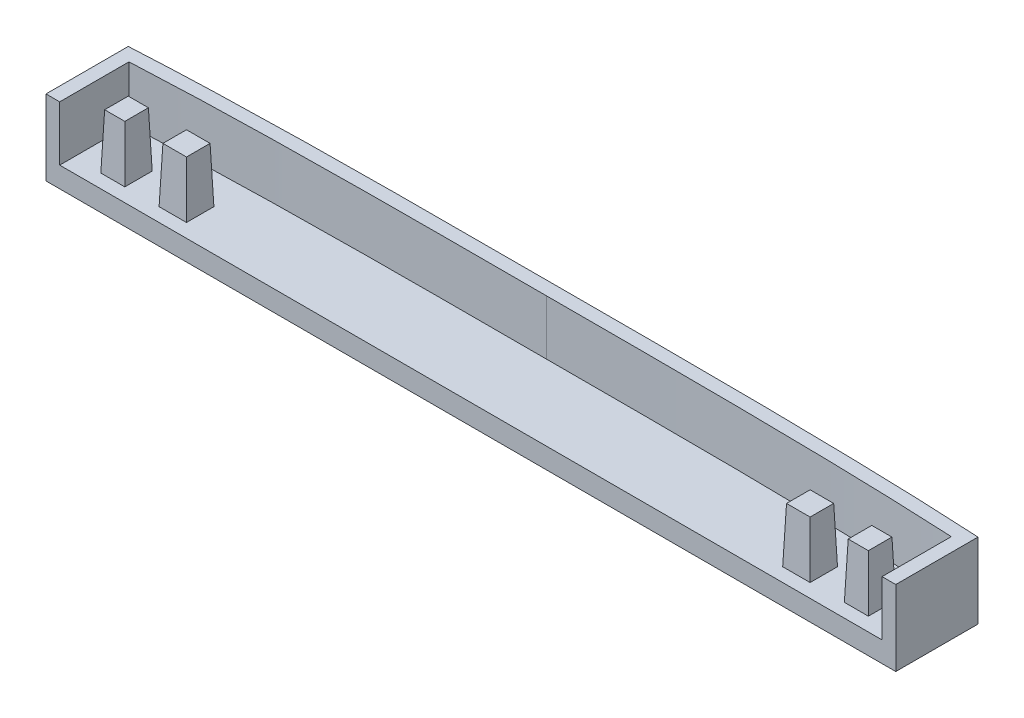
ISO-10303-21;
HEADER;
FILE_DESCRIPTION(('STEP AP214'),'2;1');
FILE_NAME('part.step','',(''),(''),'','','');
FILE_SCHEMA(('AUTOMOTIVE_DESIGN { 1 0 10303 214 1 1 1 1 }'));
ENDSEC;
DATA;
#1=APPLICATION_CONTEXT('core data for automotive mechanical design processes');
#2=APPLICATION_PROTOCOL_DEFINITION('international standard','automotive_design',2000,#1);
#3=PRODUCT_CONTEXT('',#1,'mechanical');
#4=PRODUCT('Part','Part','',(#3));
#5=PRODUCT_RELATED_PRODUCT_CATEGORY('part','',(#4));
#6=PRODUCT_DEFINITION_FORMATION('','',#4);
#7=PRODUCT_DEFINITION_CONTEXT('part definition',#1,'design');
#8=PRODUCT_DEFINITION('design','',#6,#7);
#9=PRODUCT_DEFINITION_SHAPE('','',#8);
#10=(LENGTH_UNIT() NAMED_UNIT(*) SI_UNIT(.MILLI.,.METRE.));
#11=(NAMED_UNIT(*) PLANE_ANGLE_UNIT() SI_UNIT($,.RADIAN.));
#12=(NAMED_UNIT(*) SI_UNIT($,.STERADIAN.) SOLID_ANGLE_UNIT());
#13=UNCERTAINTY_MEASURE_WITH_UNIT(LENGTH_MEASURE(1.E-05),#10,'distance_accuracy_value','');
#14=(GEOMETRIC_REPRESENTATION_CONTEXT(3) GLOBAL_UNCERTAINTY_ASSIGNED_CONTEXT((#13)) GLOBAL_UNIT_ASSIGNED_CONTEXT((#10,
#11,#12)) REPRESENTATION_CONTEXT('',''));
#15=CARTESIAN_POINT('',(0.,0.,0.));
#16=DIRECTION('',(0.,0.,1.));
#17=DIRECTION('',(1.,0.,0.));
#18=AXIS2_PLACEMENT_3D('',#15,#16,#17);
#19=CARTESIAN_POINT('',(-15.2954762235644,1.5,-6.45792529669851));
#20=DIRECTION('',(0.,1.,0.));
#21=DIRECTION('',(0.,0.,1.));
#22=AXIS2_PLACEMENT_3D('',#19,#20,#21);
#23=PLANE('',#22);
#24=DIRECTION('',(0.,0.,1.));
#25=VECTOR('',#24,1.);
#26=CARTESIAN_POINT('',(-30.,1.5,0.));
#27=LINE('',#26,#25);
#28=CARTESIAN_POINT('',(-30.,1.5,-5.05300690395027));
#29=VERTEX_POINT('',#28);
#30=CARTESIAN_POINT('',(-30.,1.5,0.));
#31=VERTEX_POINT('',#30);
#32=EDGE_CURVE('E400',#29,#31,#27,.T.);
#33=ORIENTED_EDGE('',*,*,#32,.T.);
#34=DIRECTION('',(-1.,0.,0.));
#35=VECTOR('',#34,1.);
#36=CARTESIAN_POINT('',(-30.,1.5,0.));
#37=LINE('',#36,#35);
#38=CARTESIAN_POINT('',(30.,1.5,0.));
#39=VERTEX_POINT('',#38);
#40=EDGE_CURVE('E393',#39,#31,#37,.T.);
#41=ORIENTED_EDGE('',*,*,#40,.F.);
#42=DIRECTION('',(0.,0.,-1.));
#43=VECTOR('',#42,1.);
#44=CARTESIAN_POINT('',(30.,1.5,0.));
#45=LINE('',#44,#43);
#46=CARTESIAN_POINT('',(30.,1.5,-5.05300690395027));
#47=VERTEX_POINT('',#46);
#48=EDGE_CURVE('E592',#39,#47,#45,.T.);
#49=ORIENTED_EDGE('',*,*,#48,.T.);
#50=CARTESIAN_POINT('',(30.,1.5,-5.05300690395027));
#51=CARTESIAN_POINT('',(29.6232980407042,1.5,-5.07265387252963));
#52=CARTESIAN_POINT('',(29.2465447851836,1.5,-5.09129270729749));
#53=CARTESIAN_POINT('',(28.4929531974639,1.5,-5.12672538045867));
#54=CARTESIAN_POINT('',(28.1161148656819,1.5,-5.14351922770714));
#55=CARTESIAN_POINT('',(26.9855117739003,1.5,-5.19138966924782));
#56=CARTESIAN_POINT('',(26.2316402548718,1.5,-5.21995611962589));
#57=CARTESIAN_POINT('',(24.7237960436403,1.5,-5.27147777957774));
#58=CARTESIAN_POINT('',(23.9698233731149,1.5,-5.2944336355481));
#59=CARTESIAN_POINT('',(22.461744786003,1.5,-5.33558882579871));
#60=CARTESIAN_POINT('',(21.7076388685329,1.5,-5.3537881272502));
#61=CARTESIAN_POINT('',(19.4453494050499,1.5,-5.40233176543027));
#62=CARTESIAN_POINT('',(17.9370352141215,1.5,-5.42662694769469));
#63=CARTESIAN_POINT('',(15.6744297417583,1.5,-5.45430549435337));
#64=CARTESIAN_POINT('',(14.9201840806281,1.5,-5.46207106841785));
#65=CARTESIAN_POINT('',(13.4116704608632,1.5,-5.47512736376247));
#66=CARTESIAN_POINT('',(12.6574025022247,1.5,-5.48041808461608));
#67=CARTESIAN_POINT('',(10.9111604434151,1.5,-5.49031099250601));
#68=CARTESIAN_POINT('',(9.91918234830561,1.5,-5.49417079135637));
#69=CARTESIAN_POINT('',(7.93521857787648,1.5,-5.49933276132543));
#70=CARTESIAN_POINT('',(6.94323290254634,1.5,-5.50063492780819));
#71=CARTESIAN_POINT('',(4.95937014869328,1.5,-5.50169301140521));
#72=CARTESIAN_POINT('',(3.96749307019953,1.5,-5.50144909819254));
#73=CARTESIAN_POINT('',(2.47968008228865,1.5,-5.50081831331378));
#74=CARTESIAN_POINT('',(1.98374405661157,1.5,-5.50056390011262));
#75=CARTESIAN_POINT('',(0.991872045339383,1.5,-5.50015747385048));
#76=CARTESIAN_POINT('',(0.495936059744291,1.5,-5.50000546077392));
#77=CARTESIAN_POINT('',(0.,1.5,-5.5));
#78=B_SPLINE_CURVE_WITH_KNOTS('',3,(#50,#51,#52,#53,#54,#55,#56,#57,#58,#59,#60,#61,#62,#63,#64,
#65,#66,#67,#68,#69,#70,#71,#72,#73,#74,#75,#76,#77),.UNSPECIFIED.,.F.,.F.,(4,2,2,2,2,2,2,2,2,2,
2,2,2,4),(0.,1.13163847193436,2.26327151224468,4.52648153383311,6.78943068794618,
9.05239546004916,13.5778479837032,15.8407030805466,18.1035585673908,21.0795107118779,
24.0554682505474,27.0310992011955,28.5189074845874,30.006715541544),.UNSPECIFIED.);
#79=CARTESIAN_POINT('',(0.,1.5,-5.5));
#80=VERTEX_POINT('',#79);
#81=EDGE_CURVE('E438',#47,#80,#78,.T.);
#82=ORIENTED_EDGE('',*,*,#81,.T.);
#83=CARTESIAN_POINT('',(0.,1.5,-5.5));
#84=CARTESIAN_POINT('',(-0.754204279511448,1.5,-5.50002788536174));
#85=CARTESIAN_POINT('',(-1.50840846300501,1.5,-5.50036349450039));
#86=CARTESIAN_POINT('',(-3.01681750470305,1.5,-5.50105026444585));
#87=CARTESIAN_POINT('',(-3.77102236290753,1.5,-5.50140142526667));
#88=CARTESIAN_POINT('',(-5.27947991986144,1.5,-5.50151940420532));
#89=CARTESIAN_POINT('',(-6.03373261862238,1.5,-5.50128618539688));
#90=CARTESIAN_POINT('',(-7.54223717497706,1.5,-5.499760152417));
#91=CARTESIAN_POINT('',(-8.2964890325708,1.5,-5.49846733821871));
#92=CARTESIAN_POINT('',(-9.8049967797207,1.5,-5.49437998246243));
#93=CARTESIAN_POINT('',(-10.5592526692377,1.5,-5.49158542535111));
#94=CARTESIAN_POINT('',(-12.0677543404704,1.5,-5.48407115406916));
#95=CARTESIAN_POINT('',(-12.8220001221967,1.5,-5.47935144210508));
#96=CARTESIAN_POINT('',(-14.3304411697333,1.5,-5.46755713596137));
#97=CARTESIAN_POINT('',(-15.0846364363177,1.5,-5.46048264359941));
#98=CARTESIAN_POINT('',(-16.5929992746815,1.5,-5.44352228697971));
#99=CARTESIAN_POINT('',(-17.3471668463157,1.5,-5.43363640964496));
#100=CARTESIAN_POINT('',(-19.0932055686142,1.5,-5.40691581678413));
#101=CARTESIAN_POINT('',(-20.0850587579115,1.5,-5.38887295508633));
#102=CARTESIAN_POINT('',(-22.0686061011535,1.5,-5.34573969271648));
#103=CARTESIAN_POINT('',(-23.0603002567394,1.5,-5.32064937017528));
#104=CARTESIAN_POINT('',(-24.5477207475729,1.5,-5.27646727541013));
#105=CARTESIAN_POINT('',(-25.0435448606046,1.5,-5.26064736796153));
#106=CARTESIAN_POINT('',(-26.0351083350196,1.5,-5.22656364850213));
#107=CARTESIAN_POINT('',(-26.5308476966237,1.5,-5.20829984295561));
#108=CARTESIAN_POINT('',(-27.5222389036597,1.5,-5.16903650723192));
#109=CARTESIAN_POINT('',(-28.0178907447721,1.5,-5.14803686710011));
#110=CARTESIAN_POINT('',(-29.0090576214853,1.5,-5.10293781222904));
#111=CARTESIAN_POINT('',(-29.504572655771,1.5,-5.07883836866203));
#112=CARTESIAN_POINT('',(-30.,1.5,-5.05300690395027));
#113=B_SPLINE_CURVE_WITH_KNOTS('',3,(#83,#84,#85,#86,#87,#88,#89,#90,#91,#92,#93,#94,#95,#96,
#97,#98,#99,#100,#101,#102,#103,#104,#105,#106,#107,#108,#109,#110,#111,#112),.UNSPECIFIED.,.F.,
.F.,(4,2,2,2,2,2,2,2,2,2,2,2,2,2,4),(0.,2.26261275440981,4.52522754800911,6.78798531724404,
9.05074314383125,11.3135244059297,13.5763030745085,15.8389839161692,18.1016752827412,
21.0777077795027,24.0537072841258,25.5419316332777,27.0301520460505,28.5184322896486,
30.0067263750507),.UNSPECIFIED.);
#114=EDGE_CURVE('E587',#80,#29,#113,.T.);
#115=ORIENTED_EDGE('',*,*,#114,.T.);
#116=EDGE_LOOP('',(#33,#41,#49,#82,#115));
#117=FACE_BOUND('',#116,.T.);
#118=DIRECTION('',(1.,0.,0.));
#119=VECTOR('',#118,1.);
#120=CARTESIAN_POINT('',(-28.,1.5,-0.999999999999992));
#121=LINE('',#120,#119);
#122=CARTESIAN_POINT('',(-28.,1.5,-0.999999999999992));
#123=VERTEX_POINT('',#122);
#124=CARTESIAN_POINT('',(-26.25,1.5,-0.999999999999993));
#125=VERTEX_POINT('',#124);
#126=EDGE_CURVE('E351',#123,#125,#121,.T.);
#127=ORIENTED_EDGE('',*,*,#126,.F.);
#128=DIRECTION('',(0.,0.,1.));
#129=VECTOR('',#128,1.);
#130=CARTESIAN_POINT('',(-28.,1.5,-2.99999999999999));
#131=LINE('',#130,#129);
#132=CARTESIAN_POINT('',(-28.,1.5,-2.99999999999999));
#133=VERTEX_POINT('',#132);
#134=EDGE_CURVE('E324',#133,#123,#131,.T.);
#135=ORIENTED_EDGE('',*,*,#134,.F.);
#136=DIRECTION('',(-1.,0.,0.));
#137=VECTOR('',#136,1.);
#138=CARTESIAN_POINT('',(-28.,1.5,-2.99999999999999));
#139=LINE('',#138,#137);
#140=CARTESIAN_POINT('',(-26.25,1.5,-2.99999999999999));
#141=VERTEX_POINT('',#140);
#142=EDGE_CURVE('E358',#141,#133,#139,.T.);
#143=ORIENTED_EDGE('',*,*,#142,.F.);
#144=DIRECTION('',(0.,0.,-1.));
#145=VECTOR('',#144,1.);
#146=CARTESIAN_POINT('',(-26.25,1.5,-2.99999999999999));
#147=LINE('',#146,#145);
#148=EDGE_CURVE('E354',#125,#141,#147,.T.);
#149=ORIENTED_EDGE('',*,*,#148,.F.);
#150=EDGE_LOOP('',(#127,#135,#143,#149));
#151=FACE_BOUND('',#150,.T.);
#152=DIRECTION('',(1.,0.,0.));
#153=VECTOR('',#152,1.);
#154=CARTESIAN_POINT('',(-23.75,1.5,-0.999999999999992));
#155=LINE('',#154,#153);
#156=CARTESIAN_POINT('',(-23.75,1.5,-0.999999999999992));
#157=VERTEX_POINT('',#156);
#158=CARTESIAN_POINT('',(-21.75,1.5,-0.999999999999992));
#159=VERTEX_POINT('',#158);
#160=EDGE_CURVE('E310',#157,#159,#155,.T.);
#161=ORIENTED_EDGE('',*,*,#160,.F.);
#162=DIRECTION('',(0.,0.,1.));
#163=VECTOR('',#162,1.);
#164=CARTESIAN_POINT('',(-23.75,1.5,-2.99999999999999));
#165=LINE('',#164,#163);
#166=CARTESIAN_POINT('',(-23.75,1.5,-2.99999999999999));
#167=VERTEX_POINT('',#166);
#168=EDGE_CURVE('E284',#167,#157,#165,.T.);
#169=ORIENTED_EDGE('',*,*,#168,.F.);
#170=DIRECTION('',(-1.,0.,0.));
#171=VECTOR('',#170,1.);
#172=CARTESIAN_POINT('',(-23.75,1.5,-2.99999999999999));
#173=LINE('',#172,#171);
#174=CARTESIAN_POINT('',(-21.75,1.5,-2.99999999999999));
#175=VERTEX_POINT('',#174);
#176=EDGE_CURVE('E317',#175,#167,#173,.T.);
#177=ORIENTED_EDGE('',*,*,#176,.F.);
#178=DIRECTION('',(0.,0.,-1.));
#179=VECTOR('',#178,1.);
#180=CARTESIAN_POINT('',(-21.75,1.5,-2.99999999999999));
#181=LINE('',#180,#179);
#182=EDGE_CURVE('E313',#159,#175,#181,.T.);
#183=ORIENTED_EDGE('',*,*,#182,.F.);
#184=EDGE_LOOP('',(#161,#169,#177,#183));
#185=FACE_BOUND('',#184,.T.);
#186=DIRECTION('',(0.,0.,1.));
#187=VECTOR('',#186,1.);
#188=CARTESIAN_POINT('',(21.75,1.5,-3.));
#189=LINE('',#188,#187);
#190=CARTESIAN_POINT('',(21.75,1.5,-3.));
#191=VERTEX_POINT('',#190);
#192=CARTESIAN_POINT('',(21.75,1.5,-0.999999999999998));
#193=VERTEX_POINT('',#192);
#194=EDGE_CURVE('E271',#191,#193,#189,.T.);
#195=ORIENTED_EDGE('',*,*,#194,.F.);
#196=DIRECTION('',(-1.,0.,0.));
#197=VECTOR('',#196,1.);
#198=CARTESIAN_POINT('',(23.75,1.5,-3.));
#199=LINE('',#198,#197);
#200=CARTESIAN_POINT('',(23.75,1.5,-3.));
#201=VERTEX_POINT('',#200);
#202=EDGE_CURVE('E228',#201,#191,#199,.T.);
#203=ORIENTED_EDGE('',*,*,#202,.F.);
#204=DIRECTION('',(0.,0.,-1.));
#205=VECTOR('',#204,1.);
#206=CARTESIAN_POINT('',(23.75,1.5,-3.));
#207=LINE('',#206,#205);
#208=CARTESIAN_POINT('',(23.75,1.5,-0.999999999999998));
#209=VERTEX_POINT('',#208);
#210=EDGE_CURVE('E277',#209,#201,#207,.T.);
#211=ORIENTED_EDGE('',*,*,#210,.F.);
#212=DIRECTION('',(1.,0.,0.));
#213=VECTOR('',#212,1.);
#214=CARTESIAN_POINT('',(23.75,1.5,-0.999999999999998));
#215=LINE('',#214,#213);
#216=EDGE_CURVE('E274',#193,#209,#215,.T.);
#217=ORIENTED_EDGE('',*,*,#216,.F.);
#218=EDGE_LOOP('',(#195,#203,#211,#217));
#219=FACE_BOUND('',#218,.T.);
#220=DIRECTION('',(0.,0.,1.));
#221=VECTOR('',#220,1.);
#222=CARTESIAN_POINT('',(26.25,1.5,-3.));
#223=LINE('',#222,#221);
#224=CARTESIAN_POINT('',(26.25,1.5,-3.));
#225=VERTEX_POINT('',#224);
#226=CARTESIAN_POINT('',(26.25,1.5,-0.999999999999999));
#227=VERTEX_POINT('',#226);
#228=EDGE_CURVE('E221',#225,#227,#223,.T.);
#229=ORIENTED_EDGE('',*,*,#228,.F.);
#230=DIRECTION('',(-1.,0.,0.));
#231=VECTOR('',#230,1.);
#232=CARTESIAN_POINT('',(28.,1.5,-3.));
#233=LINE('',#232,#231);
#234=CARTESIAN_POINT('',(28.,1.5,-3.));
#235=VERTEX_POINT('',#234);
#236=EDGE_CURVE('E233',#235,#225,#233,.T.);
#237=ORIENTED_EDGE('',*,*,#236,.F.);
#238=DIRECTION('',(0.,0.,-1.));
#239=VECTOR('',#238,1.);
#240=CARTESIAN_POINT('',(28.,1.5,-3.));
#241=LINE('',#240,#239);
#242=CARTESIAN_POINT('',(28.,1.5,-0.999999999999999));
#243=VERTEX_POINT('',#242);
#244=EDGE_CURVE('E246',#243,#235,#241,.T.);
#245=ORIENTED_EDGE('',*,*,#244,.F.);
#246=DIRECTION('',(1.,0.,0.));
#247=VECTOR('',#246,1.);
#248=CARTESIAN_POINT('',(28.,1.5,-0.999999999999999));
#249=LINE('',#248,#247);
#250=EDGE_CURVE('E242',#227,#243,#249,.T.);
#251=ORIENTED_EDGE('',*,*,#250,.F.);
#252=EDGE_LOOP('',(#229,#237,#245,#251));
#253=FACE_BOUND('',#252,.T.);
#254=ADVANCED_FACE('F41',(#117,#151,#185,#219,#253),#23,.T.);
#255=CARTESIAN_POINT('',(-31.,5.5,0.));
#256=DIRECTION('',(1.,0.,0.));
#257=DIRECTION('',(0.,0.,-1.));
#258=AXIS2_PLACEMENT_3D('',#255,#256,#257);
#259=PLANE('',#258);
#260=DIRECTION('',(0.,0.,1.));
#261=VECTOR('',#260,1.);
#262=CARTESIAN_POINT('',(-31.,0.,0.));
#263=LINE('',#262,#261);
#264=CARTESIAN_POINT('',(-31.,0.,-5.99999999999999));
#265=VERTEX_POINT('',#264);
#266=CARTESIAN_POINT('',(-31.,0.,0.));
#267=VERTEX_POINT('',#266);
#268=EDGE_CURVE('E612',#265,#267,#263,.T.);
#269=ORIENTED_EDGE('',*,*,#268,.T.);
#270=DIRECTION('',(0.,-1.,0.));
#271=VECTOR('',#270,1.);
#272=CARTESIAN_POINT('',(-31.,5.5,0.));
#273=LINE('',#272,#271);
#274=CARTESIAN_POINT('',(-31.,5.5,0.));
#275=VERTEX_POINT('',#274);
#276=EDGE_CURVE('E11',#275,#267,#273,.T.);
#277=ORIENTED_EDGE('',*,*,#276,.F.);
#278=DIRECTION('',(0.,0.,1.));
#279=VECTOR('',#278,1.);
#280=CARTESIAN_POINT('',(-31.,5.5,0.));
#281=LINE('',#280,#279);
#282=CARTESIAN_POINT('',(-31.,5.5,-5.99999999999999));
#283=VERTEX_POINT('',#282);
#284=EDGE_CURVE('E910',#283,#275,#281,.T.);
#285=ORIENTED_EDGE('',*,*,#284,.F.);
#286=DIRECTION('',(0.,-1.,0.));
#287=VECTOR('',#286,1.);
#288=CARTESIAN_POINT('',(-31.,5.5,-5.99999999999999));
#289=LINE('',#288,#287);
#290=EDGE_CURVE('E903',#283,#265,#289,.T.);
#291=ORIENTED_EDGE('',*,*,#290,.T.);
#292=EDGE_LOOP('',(#269,#277,#285,#291));
#293=FACE_BOUND('',#292,.T.);
#294=ADVANCED_FACE('F43',(#293),#259,.F.);
#295=CARTESIAN_POINT('',(31.,5.5,0.));
#296=DIRECTION('',(0.,0.,-1.));
#297=DIRECTION('',(-1.,0.,0.));
#298=AXIS2_PLACEMENT_3D('',#295,#296,#297);
#299=PLANE('',#298);
#300=ORIENTED_EDGE('',*,*,#40,.T.);
#301=DIRECTION('',(0.,1.,0.));
#302=VECTOR('',#301,1.);
#303=CARTESIAN_POINT('',(-30.,-58.5187470712277,0.));
#304=LINE('',#303,#302);
#305=CARTESIAN_POINT('',(-30.,5.5,0.));
#306=VERTEX_POINT('',#305);
#307=EDGE_CURVE('E365',#31,#306,#304,.T.);
#308=ORIENTED_EDGE('',*,*,#307,.T.);
#309=DIRECTION('',(1.,0.,0.));
#310=VECTOR('',#309,1.);
#311=CARTESIAN_POINT('',(31.,5.5,0.));
#312=LINE('',#311,#310);
#313=EDGE_CURVE('E922',#275,#306,#312,.T.);
#314=ORIENTED_EDGE('',*,*,#313,.F.);
#315=ORIENTED_EDGE('',*,*,#276,.T.);
#316=DIRECTION('',(1.,0.,0.));
#317=VECTOR('',#316,1.);
#318=CARTESIAN_POINT('',(31.,0.,0.));
#319=LINE('',#318,#317);
#320=CARTESIAN_POINT('',(31.,0.,0.));
#321=VERTEX_POINT('',#320);
#322=EDGE_CURVE('E617',#267,#321,#319,.T.);
#323=ORIENTED_EDGE('',*,*,#322,.T.);
#324=DIRECTION('',(0.,-1.,0.));
#325=VECTOR('',#324,1.);
#326=CARTESIAN_POINT('',(31.,5.5,0.));
#327=LINE('',#326,#325);
#328=CARTESIAN_POINT('',(31.,5.5,0.));
#329=VERTEX_POINT('',#328);
#330=EDGE_CURVE('E50',#329,#321,#327,.T.);
#331=ORIENTED_EDGE('',*,*,#330,.F.);
#332=CARTESIAN_POINT('',(30.,5.5,0.));
#333=VERTEX_POINT('',#332);
#334=EDGE_CURVE('E600',#333,#329,#312,.T.);
#335=ORIENTED_EDGE('',*,*,#334,.F.);
#336=DIRECTION('',(0.,1.,0.));
#337=VECTOR('',#336,1.);
#338=CARTESIAN_POINT('',(30.,-58.5187470712277,0.));
#339=LINE('',#338,#337);
#340=EDGE_CURVE('E389',#39,#333,#339,.T.);
#341=ORIENTED_EDGE('',*,*,#340,.F.);
#342=EDGE_LOOP('',(#300,#308,#314,#315,#323,#331,#335,#341));
#343=FACE_BOUND('',#342,.T.);
#344=ADVANCED_FACE('F546',(#343),#299,.F.);
#345=CARTESIAN_POINT('',(31.,5.5,0.));
#346=DIRECTION('',(-1.,0.,0.));
#347=DIRECTION('',(0.,0.,1.));
#348=AXIS2_PLACEMENT_3D('',#345,#346,#347);
#349=PLANE('',#348);
#350=DIRECTION('',(0.,0.,-1.));
#351=VECTOR('',#350,1.);
#352=CARTESIAN_POINT('',(31.,0.,0.));
#353=LINE('',#352,#351);
#354=CARTESIAN_POINT('',(31.,0.,-6.));
#355=VERTEX_POINT('',#354);
#356=EDGE_CURVE('E918',#321,#355,#353,.T.);
#357=ORIENTED_EDGE('',*,*,#356,.T.);
#358=DIRECTION('',(0.,-1.,0.));
#359=VECTOR('',#358,1.);
#360=CARTESIAN_POINT('',(31.,5.5,-6.));
#361=LINE('',#360,#359);
#362=CARTESIAN_POINT('',(31.,5.5,-6.));
#363=VERTEX_POINT('',#362);
#364=EDGE_CURVE('E946',#363,#355,#361,.T.);
#365=ORIENTED_EDGE('',*,*,#364,.F.);
#366=DIRECTION('',(0.,0.,-1.));
#367=VECTOR('',#366,1.);
#368=CARTESIAN_POINT('',(31.,5.5,0.));
#369=LINE('',#368,#367);
#370=EDGE_CURVE('E408',#329,#363,#369,.T.);
#371=ORIENTED_EDGE('',*,*,#370,.F.);
#372=ORIENTED_EDGE('',*,*,#330,.T.);
#373=EDGE_LOOP('',(#357,#365,#371,#372));
#374=FACE_BOUND('',#373,.T.);
#375=ADVANCED_FACE('F423',(#374),#349,.F.);
#376=CARTESIAN_POINT('',(31.,5.5,-6.));
#377=CARTESIAN_POINT('',(21.2515523068222,5.5,-6.55446745786269));
#378=CARTESIAN_POINT('',(9.20305095601617,5.5,-6.5));
#379=CARTESIAN_POINT('',(0.,5.5,-6.5));
#380=B_SPLINE_CURVE_WITH_KNOTS('',3,(#376,#377,#378,#379),.UNSPECIFIED.,.F.,.F.,(4,4),(0.,1.),.UNSPECIFIED.);
#381=DIRECTION('',(0.,-1.,0.));
#382=VECTOR('',#381,1.);
#383=SURFACE_OF_LINEAR_EXTRUSION('',#380,#382);
#384=CARTESIAN_POINT('',(31.,0.,-6.));
#385=CARTESIAN_POINT('',(21.2515523068222,0.,-6.55446745786269));
#386=CARTESIAN_POINT('',(9.20305095601617,0.,-6.5));
#387=CARTESIAN_POINT('',(0.,0.,-6.5));
#388=B_SPLINE_CURVE_WITH_KNOTS('',3,(#384,#385,#386,#387),.UNSPECIFIED.,.F.,.F.,(4,4),(0.,1.),.UNSPECIFIED.);
#389=CARTESIAN_POINT('',(0.,0.,-6.5));
#390=VERTEX_POINT('',#389);
#391=EDGE_CURVE('E911',#355,#390,#388,.T.);
#392=ORIENTED_EDGE('',*,*,#391,.T.);
#393=DIRECTION('',(0.,-1.,0.));
#394=VECTOR('',#393,1.);
#395=CARTESIAN_POINT('',(0.,5.5,-6.5));
#396=LINE('',#395,#394);
#397=CARTESIAN_POINT('',(0.,5.5,-6.5));
#398=VERTEX_POINT('',#397);
#399=EDGE_CURVE('E906',#398,#390,#396,.T.);
#400=ORIENTED_EDGE('',*,*,#399,.F.);
#401=EDGE_CURVE('E401',#363,#398,#380,.T.);
#402=ORIENTED_EDGE('',*,*,#401,.F.);
#403=ORIENTED_EDGE('',*,*,#364,.T.);
#404=EDGE_LOOP('',(#392,#400,#402,#403));
#405=FACE_BOUND('',#404,.T.);
#406=ADVANCED_FACE('F417',(#405),#383,.F.);
#407=CARTESIAN_POINT('',(0.,5.5,-6.5));
#408=CARTESIAN_POINT('',(-9.20305095601617,5.5,-6.5));
#409=CARTESIAN_POINT('',(-21.2515523068222,5.5,-6.55446745786269));
#410=CARTESIAN_POINT('',(-31.,5.5,-5.99999999999999));
#411=B_SPLINE_CURVE_WITH_KNOTS('',3,(#407,#408,#409,#410),.UNSPECIFIED.,.F.,.F.,(4,4),(0.,1.),.UNSPECIFIED.);
#412=DIRECTION('',(0.,-1.,0.));
#413=VECTOR('',#412,1.);
#414=SURFACE_OF_LINEAR_EXTRUSION('',#411,#413);
#415=CARTESIAN_POINT('',(0.,0.,-6.5));
#416=CARTESIAN_POINT('',(-9.20305095601617,0.,-6.5));
#417=CARTESIAN_POINT('',(-21.2515523068222,0.,-6.55446745786269));
#418=CARTESIAN_POINT('',(-31.,0.,-5.99999999999999));
#419=B_SPLINE_CURVE_WITH_KNOTS('',3,(#415,#416,#417,#418),.UNSPECIFIED.,.F.,.F.,(4,4),(0.,1.),.UNSPECIFIED.);
#420=EDGE_CURVE('E900',#390,#265,#419,.T.);
#421=ORIENTED_EDGE('',*,*,#420,.T.);
#422=ORIENTED_EDGE('',*,*,#290,.F.);
#423=EDGE_CURVE('E407',#398,#283,#411,.T.);
#424=ORIENTED_EDGE('',*,*,#423,.F.);
#425=ORIENTED_EDGE('',*,*,#399,.T.);
#426=EDGE_LOOP('',(#421,#422,#424,#425));
#427=FACE_BOUND('',#426,.T.);
#428=ADVANCED_FACE('F422',(#427),#414,.F.);
#429=CARTESIAN_POINT('',(-15.2954762235644,5.5,-6.45792529669851));
#430=DIRECTION('',(0.,1.,0.));
#431=DIRECTION('',(0.,0.,1.));
#432=AXIS2_PLACEMENT_3D('',#429,#430,#431);
#433=PLANE('',#432);
#434=ORIENTED_EDGE('',*,*,#313,.T.);
#435=DIRECTION('',(0.,0.,1.));
#436=VECTOR('',#435,1.);
#437=CARTESIAN_POINT('',(-30.,5.5,0.));
#438=LINE('',#437,#436);
#439=CARTESIAN_POINT('',(-30.,5.5,-5.05300690395027));
#440=VERTEX_POINT('',#439);
#441=EDGE_CURVE('E595',#440,#306,#438,.T.);
#442=ORIENTED_EDGE('',*,*,#441,.F.);
#443=CARTESIAN_POINT('',(0.,5.5,-5.5));
#444=CARTESIAN_POINT('',(-0.75420427951145,5.5,-5.50002788536174));
#445=CARTESIAN_POINT('',(-1.50840846300501,5.5,-5.50036349450039));
#446=CARTESIAN_POINT('',(-3.01681750470305,5.5,-5.50105026444585));
#447=CARTESIAN_POINT('',(-3.77102236290753,5.5,-5.50140142526667));
#448=CARTESIAN_POINT('',(-5.27947991986144,5.5,-5.50151940420532));
#449=CARTESIAN_POINT('',(-6.03373261862238,5.5,-5.50128618539688));
#450=CARTESIAN_POINT('',(-7.54223717497706,5.5,-5.499760152417));
#451=CARTESIAN_POINT('',(-8.2964890325708,5.5,-5.49846733821871));
#452=CARTESIAN_POINT('',(-9.8049967797207,5.5,-5.49437998246243));
#453=CARTESIAN_POINT('',(-10.5592526692377,5.5,-5.49158542535111));
#454=CARTESIAN_POINT('',(-12.0677543404704,5.5,-5.48407115406916));
#455=CARTESIAN_POINT('',(-12.8220001221967,5.5,-5.47935144210508));
#456=CARTESIAN_POINT('',(-14.3304411697333,5.5,-5.46755713596137));
#457=CARTESIAN_POINT('',(-15.0846364363177,5.5,-5.46048264359941));
#458=CARTESIAN_POINT('',(-16.5929992746815,5.5,-5.44352228697971));
#459=CARTESIAN_POINT('',(-17.3471668463157,5.5,-5.43363640964496));
#460=CARTESIAN_POINT('',(-19.0932055686142,5.5,-5.40691581678413));
#461=CARTESIAN_POINT('',(-20.0850587579115,5.5,-5.38887295508633));
#462=CARTESIAN_POINT('',(-22.0686061011535,5.5,-5.34573969271648));
#463=CARTESIAN_POINT('',(-23.0603002567394,5.5,-5.32064937017528));
#464=CARTESIAN_POINT('',(-24.5477207475729,5.5,-5.27646727541013));
#465=CARTESIAN_POINT('',(-25.0435448606046,5.5,-5.26064736796153));
#466=CARTESIAN_POINT('',(-26.0351083350196,5.5,-5.22656364850213));
#467=CARTESIAN_POINT('',(-26.5308476966237,5.5,-5.20829984295561));
#468=CARTESIAN_POINT('',(-27.5222389036597,5.5,-5.16903650723192));
#469=CARTESIAN_POINT('',(-28.0178907447721,5.5,-5.14803686710011));
#470=CARTESIAN_POINT('',(-29.0090576214853,5.5,-5.10293781222904));
#471=CARTESIAN_POINT('',(-29.504572655771,5.5,-5.07883836866203));
#472=CARTESIAN_POINT('',(-30.,5.5,-5.05300690395027));
#473=B_SPLINE_CURVE_WITH_KNOTS('',3,(#443,#444,#445,#446,#447,#448,#449,#450,#451,#452,#453,
#454,#455,#456,#457,#458,#459,#460,#461,#462,#463,#464,#465,#466,#467,#468,#469,#470,#471,#472),
.UNSPECIFIED.,.F.,.F.,(4,2,2,2,2,2,2,2,2,2,2,2,2,2,4),(0.,2.26261275440981,4.52522754800911,
6.78798531724404,9.05074314383125,11.3135244059297,13.5763030745085,15.8389839161692,
18.1016752827412,21.0777077795027,24.0537072841258,25.5419316332777,27.0301520460505,
28.5184322896486,30.0067263750507),.UNSPECIFIED.);
#474=CARTESIAN_POINT('',(0.,5.5,-5.5));
#475=VERTEX_POINT('',#474);
#476=EDGE_CURVE('E455',#475,#440,#473,.T.);
#477=ORIENTED_EDGE('',*,*,#476,.F.);
#478=CARTESIAN_POINT('',(30.,5.5,-5.05300690395027));
#479=CARTESIAN_POINT('',(29.6232980407042,5.5,-5.07265387252963));
#480=CARTESIAN_POINT('',(29.2465447851836,5.5,-5.0912927072975));
#481=CARTESIAN_POINT('',(28.4929531974639,5.5,-5.12672538045867));
#482=CARTESIAN_POINT('',(28.1161148656819,5.5,-5.14351922770714));
#483=CARTESIAN_POINT('',(26.9855117739003,5.5,-5.19138966924781));
#484=CARTESIAN_POINT('',(26.2316402548718,5.5,-5.21995611962589));
#485=CARTESIAN_POINT('',(24.7237960436404,5.5,-5.27147777957774));
#486=CARTESIAN_POINT('',(23.9698233731149,5.5,-5.2944336355481));
#487=CARTESIAN_POINT('',(22.461744786003,5.5,-5.33558882579871));
#488=CARTESIAN_POINT('',(21.7076388685329,5.5,-5.3537881272502));
#489=CARTESIAN_POINT('',(19.4453494050499,5.5,-5.40233176543027));
#490=CARTESIAN_POINT('',(17.9370352141215,5.5,-5.42662694769469));
#491=CARTESIAN_POINT('',(15.6744297417583,5.5,-5.45430549435337));
#492=CARTESIAN_POINT('',(14.9201840806281,5.5,-5.46207106841785));
#493=CARTESIAN_POINT('',(13.4116704608632,5.5,-5.47512736376247));
#494=CARTESIAN_POINT('',(12.6574025022247,5.5,-5.48041808461608));
#495=CARTESIAN_POINT('',(10.9111604434151,5.5,-5.490310992506));
#496=CARTESIAN_POINT('',(9.91918234830561,5.5,-5.49417079135637));
#497=CARTESIAN_POINT('',(7.93521857787649,5.5,-5.49933276132543));
#498=CARTESIAN_POINT('',(6.94323290254635,5.5,-5.50063492780819));
#499=CARTESIAN_POINT('',(4.95937014869329,5.5,-5.50169301140521));
#500=CARTESIAN_POINT('',(3.96749307019954,5.5,-5.50144909819254));
#501=CARTESIAN_POINT('',(2.47968008228866,5.5,-5.50081831331378));
#502=CARTESIAN_POINT('',(1.98374405661157,5.5,-5.50056390011262));
#503=CARTESIAN_POINT('',(0.991872045339385,5.5,-5.50015747385048));
#504=CARTESIAN_POINT('',(0.495936059744291,5.5,-5.50000546077392));
#505=CARTESIAN_POINT('',(0.,5.5,-5.5));
#506=B_SPLINE_CURVE_WITH_KNOTS('',3,(#478,#479,#480,#481,#482,#483,#484,#485,#486,#487,#488,
#489,#490,#491,#492,#493,#494,#495,#496,#497,#498,#499,#500,#501,#502,#503,#504,#505),
.UNSPECIFIED.,.F.,.F.,(4,2,2,2,2,2,2,2,2,2,2,2,2,4),(0.,1.13163847193436,2.26327151224468,
4.5264815338331,6.78943068794617,9.05239546004915,13.5778479837032,15.8407030805466,
18.1035585673908,21.0795107118779,24.0554682505474,27.0310992011955,28.5189074845874,
30.006715541544),.UNSPECIFIED.);
#507=CARTESIAN_POINT('',(30.,5.5,-5.05300690395027));
#508=VERTEX_POINT('',#507);
#509=EDGE_CURVE('E446',#508,#475,#506,.T.);
#510=ORIENTED_EDGE('',*,*,#509,.F.);
#511=DIRECTION('',(0.,0.,-1.));
#512=VECTOR('',#511,1.);
#513=CARTESIAN_POINT('',(30.,5.5,0.));
#514=LINE('',#513,#512);
#515=EDGE_CURVE('E456',#333,#508,#514,.T.);
#516=ORIENTED_EDGE('',*,*,#515,.F.);
#517=ORIENTED_EDGE('',*,*,#334,.T.);
#518=ORIENTED_EDGE('',*,*,#370,.T.);
#519=ORIENTED_EDGE('',*,*,#401,.T.);
#520=ORIENTED_EDGE('',*,*,#423,.T.);
#521=ORIENTED_EDGE('',*,*,#284,.T.);
#522=EDGE_LOOP('',(#434,#442,#477,#510,#516,#517,#518,#519,#520,#521));
#523=FACE_BOUND('',#522,.T.);
#524=ADVANCED_FACE('F637',(#523),#433,.T.);
#525=CARTESIAN_POINT('',(-15.2954762235644,0.,-6.45792529669851));
#526=DIRECTION('',(0.,1.,0.));
#527=DIRECTION('',(0.,0.,1.));
#528=AXIS2_PLACEMENT_3D('',#525,#526,#527);
#529=PLANE('',#528);
#530=ORIENTED_EDGE('',*,*,#268,.F.);
#531=ORIENTED_EDGE('',*,*,#420,.F.);
#532=ORIENTED_EDGE('',*,*,#391,.F.);
#533=ORIENTED_EDGE('',*,*,#356,.F.);
#534=ORIENTED_EDGE('',*,*,#322,.F.);
#535=EDGE_LOOP('',(#530,#531,#532,#533,#534));
#536=FACE_BOUND('',#535,.T.);
#537=ADVANCED_FACE('F634',(#536),#529,.F.);
#538=CARTESIAN_POINT('',(-30.,5.5,0.));
#539=DIRECTION('',(1.,0.,0.));
#540=DIRECTION('',(0.,0.,-1.));
#541=AXIS2_PLACEMENT_3D('',#538,#539,#540);
#542=PLANE('',#541);
#543=ORIENTED_EDGE('',*,*,#32,.F.);
#544=DIRECTION('',(0.,-1.,0.));
#545=VECTOR('',#544,1.);
#546=CARTESIAN_POINT('',(-30.,5.5,-5.05300690395027));
#547=LINE('',#546,#545);
#548=EDGE_CURVE('E610',#440,#29,#547,.T.);
#549=ORIENTED_EDGE('',*,*,#548,.F.);
#550=ORIENTED_EDGE('',*,*,#441,.T.);
#551=ORIENTED_EDGE('',*,*,#307,.F.);
#552=EDGE_LOOP('',(#543,#549,#550,#551));
#553=FACE_BOUND('',#552,.T.);
#554=ADVANCED_FACE('F593',(#553),#542,.T.);
#555=CARTESIAN_POINT('',(30.,5.5,0.));
#556=DIRECTION('',(-1.,0.,0.));
#557=DIRECTION('',(0.,0.,1.));
#558=AXIS2_PLACEMENT_3D('',#555,#556,#557);
#559=PLANE('',#558);
#560=ORIENTED_EDGE('',*,*,#48,.F.);
#561=ORIENTED_EDGE('',*,*,#340,.T.);
#562=ORIENTED_EDGE('',*,*,#515,.T.);
#563=DIRECTION('',(0.,-1.,0.));
#564=VECTOR('',#563,1.);
#565=CARTESIAN_POINT('',(30.,5.5,-5.05300690395027));
#566=LINE('',#565,#564);
#567=EDGE_CURVE('E604',#508,#47,#566,.T.);
#568=ORIENTED_EDGE('',*,*,#567,.T.);
#569=EDGE_LOOP('',(#560,#561,#562,#568));
#570=FACE_BOUND('',#569,.T.);
#571=ADVANCED_FACE('F432',(#570),#559,.T.);
#572=CARTESIAN_POINT('',(31.,5.5,-6.));
#573=CARTESIAN_POINT('',(21.2515523068222,5.5,-6.55446745786269));
#574=CARTESIAN_POINT('',(9.20305095601617,5.5,-6.5));
#575=CARTESIAN_POINT('',(0.,5.5,-6.5));
#576=B_SPLINE_CURVE_WITH_KNOTS('',3,(#572,#573,#574,#575),.UNSPECIFIED.,.F.,.F.,(4,4),(0.,1.),.UNSPECIFIED.);
#577=DIRECTION('',(0.,-1.,0.));
#578=VECTOR('',#577,1.);
#579=SURFACE_OF_LINEAR_EXTRUSION('',#576,#578);
#580=OFFSET_SURFACE('',#579,0.999999999999999,.F.);
#581=ORIENTED_EDGE('',*,*,#81,.F.);
#582=ORIENTED_EDGE('',*,*,#567,.F.);
#583=ORIENTED_EDGE('',*,*,#509,.T.);
#584=DIRECTION('',(0.,-1.,0.));
#585=VECTOR('',#584,1.);
#586=CARTESIAN_POINT('',(0.,5.5,-5.5));
#587=LINE('',#586,#585);
#588=EDGE_CURVE('E613',#475,#80,#587,.T.);
#589=ORIENTED_EDGE('',*,*,#588,.T.);
#590=EDGE_LOOP('',(#581,#582,#583,#589));
#591=FACE_BOUND('',#590,.T.);
#592=ADVANCED_FACE('F427',(#591),#580,.T.);
#593=CARTESIAN_POINT('',(0.,5.5,-6.5));
#594=CARTESIAN_POINT('',(-9.20305095601617,5.5,-6.5));
#595=CARTESIAN_POINT('',(-21.2515523068222,5.5,-6.55446745786269));
#596=CARTESIAN_POINT('',(-31.,5.5,-5.99999999999999));
#597=B_SPLINE_CURVE_WITH_KNOTS('',3,(#593,#594,#595,#596),.UNSPECIFIED.,.F.,.F.,(4,4),(0.,1.),.UNSPECIFIED.);
#598=DIRECTION('',(0.,-1.,0.));
#599=VECTOR('',#598,1.);
#600=SURFACE_OF_LINEAR_EXTRUSION('',#597,#599);
#601=OFFSET_SURFACE('',#600,0.999999999999999,.F.);
#602=ORIENTED_EDGE('',*,*,#114,.F.);
#603=ORIENTED_EDGE('',*,*,#588,.F.);
#604=ORIENTED_EDGE('',*,*,#476,.T.);
#605=ORIENTED_EDGE('',*,*,#548,.T.);
#606=EDGE_LOOP('',(#602,#603,#604,#605));
#607=FACE_BOUND('',#606,.T.);
#608=ADVANCED_FACE('F431',(#607),#601,.T.);
#609=CARTESIAN_POINT('',(-28.,1.5,-2.99999999999999));
#610=DIRECTION('',(-0.999390827019096,0.034899496702501,0.));
#611=DIRECTION('',(-0.034899496702501,-0.999390827019096,0.));
#612=AXIS2_PLACEMENT_3D('',#609,#610,#611);
#613=PLANE('',#612);
#614=ORIENTED_EDGE('',*,*,#134,.T.);
#615=DIRECTION('',(-0.0348782627423747,-0.998782765958718,0.0348782627423747));
#616=VECTOR('',#615,1.);
#617=CARTESIAN_POINT('',(-28.,1.5,-0.999999999999992));
#618=LINE('',#617,#616);
#619=CARTESIAN_POINT('',(-27.860316922033,5.5,-1.13968307796698));
#620=VERTEX_POINT('',#619);
#621=EDGE_CURVE('E362',#620,#123,#618,.T.);
#622=ORIENTED_EDGE('',*,*,#621,.F.);
#623=DIRECTION('',(0.,0.,-1.));
#624=VECTOR('',#623,1.);
#625=CARTESIAN_POINT('',(-27.860316922033,5.5,-2.99999999999999));
#626=LINE('',#625,#624);
#627=CARTESIAN_POINT('',(-27.860316922033,5.5,-2.860316922033));
#628=VERTEX_POINT('',#627);
#629=EDGE_CURVE('E361',#628,#620,#626,.F.);
#630=ORIENTED_EDGE('',*,*,#629,.F.);
#631=DIRECTION('',(-0.0348782627423747,-0.998782765958718,-0.0348782627423747));
#632=VECTOR('',#631,1.);
#633=CARTESIAN_POINT('',(-28.,1.5,-2.99999999999999));
#634=LINE('',#633,#632);
#635=EDGE_CURVE('E367',#628,#133,#634,.T.);
#636=ORIENTED_EDGE('',*,*,#635,.T.);
#637=EDGE_LOOP('',(#614,#622,#630,#636));
#638=FACE_BOUND('',#637,.T.);
#639=ADVANCED_FACE('F470',(#638),#613,.T.);
#640=CARTESIAN_POINT('',(-28.,1.5,-0.999999999999992));
#641=DIRECTION('',(0.,0.034899496702501,0.999390827019096));
#642=DIRECTION('',(0.,-0.999390827019096,0.034899496702501));
#643=AXIS2_PLACEMENT_3D('',#640,#641,#642);
#644=PLANE('',#643);
#645=ORIENTED_EDGE('',*,*,#126,.T.);
#646=DIRECTION('',(0.0348782627423746,-0.998782765958718,0.0348782627423747));
#647=VECTOR('',#646,1.);
#648=CARTESIAN_POINT('',(-26.2524329864239,1.56967161546733,-1.00243298642384));
#649=LINE('',#648,#647);
#650=CARTESIAN_POINT('',(-26.389683077967,5.5,-1.13968307796698));
#651=VERTEX_POINT('',#650);
#652=EDGE_CURVE('E366',#651,#125,#649,.T.);
#653=ORIENTED_EDGE('',*,*,#652,.F.);
#654=DIRECTION('',(-1.,0.,0.));
#655=VECTOR('',#654,1.);
#656=CARTESIAN_POINT('',(-28.,5.5,-1.13968307796698));
#657=LINE('',#656,#655);
#658=EDGE_CURVE('E381',#620,#651,#657,.F.);
#659=ORIENTED_EDGE('',*,*,#658,.F.);
#660=ORIENTED_EDGE('',*,*,#621,.T.);
#661=EDGE_LOOP('',(#645,#653,#659,#660));
#662=FACE_BOUND('',#661,.T.);
#663=ADVANCED_FACE('F465',(#662),#644,.T.);
#664=CARTESIAN_POINT('',(-26.25,1.5,-2.99999999999999));
#665=DIRECTION('',(0.999390827019096,0.034899496702501,0.));
#666=DIRECTION('',(-0.034899496702501,0.999390827019096,0.));
#667=AXIS2_PLACEMENT_3D('',#664,#665,#666);
#668=PLANE('',#667);
#669=ORIENTED_EDGE('',*,*,#148,.T.);
#670=DIRECTION('',(0.0348782627423747,-0.998782765958718,-0.0348782627423747));
#671=VECTOR('',#670,1.);
#672=CARTESIAN_POINT('',(-26.2521288631209,1.56096266353391,-2.99787113687912));
#673=LINE('',#672,#671);
#674=CARTESIAN_POINT('',(-26.389683077967,5.5,-2.860316922033));
#675=VERTEX_POINT('',#674);
#676=EDGE_CURVE('E371',#675,#141,#673,.T.);
#677=ORIENTED_EDGE('',*,*,#676,.F.);
#678=DIRECTION('',(0.,0.,1.));
#679=VECTOR('',#678,1.);
#680=CARTESIAN_POINT('',(-26.389683077967,5.5,-2.99999999999999));
#681=LINE('',#680,#679);
#682=EDGE_CURVE('E384',#651,#675,#681,.F.);
#683=ORIENTED_EDGE('',*,*,#682,.F.);
#684=ORIENTED_EDGE('',*,*,#652,.T.);
#685=EDGE_LOOP('',(#669,#677,#683,#684));
#686=FACE_BOUND('',#685,.T.);
#687=ADVANCED_FACE('F469',(#686),#668,.T.);
#688=CARTESIAN_POINT('',(-28.,1.5,-2.99999999999999));
#689=DIRECTION('',(0.,0.034899496702501,-0.999390827019096));
#690=DIRECTION('',(0.,0.999390827019096,0.034899496702501));
#691=AXIS2_PLACEMENT_3D('',#688,#689,#690);
#692=PLANE('',#691);
#693=ORIENTED_EDGE('',*,*,#142,.T.);
#694=ORIENTED_EDGE('',*,*,#635,.F.);
#695=DIRECTION('',(1.,0.,0.));
#696=VECTOR('',#695,1.);
#697=CARTESIAN_POINT('',(-28.,5.5,-2.860316922033));
#698=LINE('',#697,#696);
#699=EDGE_CURVE('E372',#675,#628,#698,.F.);
#700=ORIENTED_EDGE('',*,*,#699,.F.);
#701=ORIENTED_EDGE('',*,*,#676,.T.);
#702=EDGE_LOOP('',(#693,#694,#700,#701));
#703=FACE_BOUND('',#702,.T.);
#704=ADVANCED_FACE('F474',(#703),#692,.T.);
#705=CARTESIAN_POINT('',(0.,5.5,0.));
#706=DIRECTION('',(0.,1.,0.));
#707=DIRECTION('',(0.,0.,1.));
#708=AXIS2_PLACEMENT_3D('',#705,#706,#707);
#709=PLANE('',#708);
#710=ORIENTED_EDGE('',*,*,#629,.T.);
#711=ORIENTED_EDGE('',*,*,#658,.T.);
#712=ORIENTED_EDGE('',*,*,#682,.T.);
#713=ORIENTED_EDGE('',*,*,#699,.T.);
#714=EDGE_LOOP('',(#710,#711,#712,#713));
#715=FACE_BOUND('',#714,.T.);
#716=ADVANCED_FACE('F478',(#715),#709,.T.);
#717=CARTESIAN_POINT('',(-23.75,1.5,-2.99999999999999));
#718=DIRECTION('',(-0.999390827019096,0.034899496702501,0.));
#719=DIRECTION('',(-0.034899496702501,-0.999390827019096,0.));
#720=AXIS2_PLACEMENT_3D('',#717,#718,#719);
#721=PLANE('',#720);
#722=ORIENTED_EDGE('',*,*,#168,.T.);
#723=DIRECTION('',(-0.0348782627423747,-0.998782765958718,0.0348782627423747));
#724=VECTOR('',#723,1.);
#725=CARTESIAN_POINT('',(-23.75,1.5,-0.999999999999992));
#726=LINE('',#725,#724);
#727=CARTESIAN_POINT('',(-23.610316922033,5.5,-1.13968307796698));
#728=VERTEX_POINT('',#727);
#729=EDGE_CURVE('E321',#728,#157,#726,.T.);
#730=ORIENTED_EDGE('',*,*,#729,.F.);
#731=DIRECTION('',(0.,0.,-1.));
#732=VECTOR('',#731,1.);
#733=CARTESIAN_POINT('',(-23.610316922033,5.5,-2.99999999999999));
#734=LINE('',#733,#732);
#735=CARTESIAN_POINT('',(-23.610316922033,5.5,-2.860316922033));
#736=VERTEX_POINT('',#735);
#737=EDGE_CURVE('E320',#736,#728,#734,.F.);
#738=ORIENTED_EDGE('',*,*,#737,.F.);
#739=DIRECTION('',(-0.0348782627423747,-0.998782765958718,-0.0348782627423747));
#740=VECTOR('',#739,1.);
#741=CARTESIAN_POINT('',(-23.75,1.5,-2.99999999999999));
#742=LINE('',#741,#740);
#743=EDGE_CURVE('E326',#736,#167,#742,.T.);
#744=ORIENTED_EDGE('',*,*,#743,.T.);
#745=EDGE_LOOP('',(#722,#730,#738,#744));
#746=FACE_BOUND('',#745,.T.);
#747=ADVANCED_FACE('F485',(#746),#721,.T.);
#748=CARTESIAN_POINT('',(-23.75,1.5,-0.999999999999992));
#749=DIRECTION('',(0.,0.034899496702501,0.999390827019096));
#750=DIRECTION('',(0.,-0.999390827019096,0.034899496702501));
#751=AXIS2_PLACEMENT_3D('',#748,#749,#750);
#752=PLANE('',#751);
#753=ORIENTED_EDGE('',*,*,#160,.T.);
#754=DIRECTION('',(0.0348782627423747,-0.998782765958718,0.0348782627423747));
#755=VECTOR('',#754,1.);
#756=CARTESIAN_POINT('',(-21.7524329864238,1.56967161546733,-1.00243298642384));
#757=LINE('',#756,#755);
#758=CARTESIAN_POINT('',(-21.889683077967,5.5,-1.13968307796698));
#759=VERTEX_POINT('',#758);
#760=EDGE_CURVE('E325',#759,#159,#757,.T.);
#761=ORIENTED_EDGE('',*,*,#760,.F.);
#762=DIRECTION('',(-1.,0.,0.));
#763=VECTOR('',#762,1.);
#764=CARTESIAN_POINT('',(-23.75,5.5,-1.13968307796698));
#765=LINE('',#764,#763);
#766=EDGE_CURVE('E340',#728,#759,#765,.F.);
#767=ORIENTED_EDGE('',*,*,#766,.F.);
#768=ORIENTED_EDGE('',*,*,#729,.T.);
#769=EDGE_LOOP('',(#753,#761,#767,#768));
#770=FACE_BOUND('',#769,.T.);
#771=ADVANCED_FACE('F487',(#770),#752,.T.);
#772=CARTESIAN_POINT('',(-21.75,1.5,-2.99999999999999));
#773=DIRECTION('',(0.999390827019096,0.034899496702501,0.));
#774=DIRECTION('',(-0.034899496702501,0.999390827019096,0.));
#775=AXIS2_PLACEMENT_3D('',#772,#773,#774);
#776=PLANE('',#775);
#777=ORIENTED_EDGE('',*,*,#182,.T.);
#778=DIRECTION('',(0.0348782627423747,-0.998782765958718,-0.0348782627423747));
#779=VECTOR('',#778,1.);
#780=CARTESIAN_POINT('',(-21.7524329864238,1.56967161546733,-2.99756701357614));
#781=LINE('',#780,#779);
#782=CARTESIAN_POINT('',(-21.889683077967,5.5,-2.860316922033));
#783=VERTEX_POINT('',#782);
#784=EDGE_CURVE('E330',#783,#175,#781,.T.);
#785=ORIENTED_EDGE('',*,*,#784,.F.);
#786=DIRECTION('',(0.,0.,1.));
#787=VECTOR('',#786,1.);
#788=CARTESIAN_POINT('',(-21.889683077967,5.5,-2.99999999999999));
#789=LINE('',#788,#787);
#790=EDGE_CURVE('E343',#759,#783,#789,.F.);
#791=ORIENTED_EDGE('',*,*,#790,.F.);
#792=ORIENTED_EDGE('',*,*,#760,.T.);
#793=EDGE_LOOP('',(#777,#785,#791,#792));
#794=FACE_BOUND('',#793,.T.);
#795=ADVANCED_FACE('F490',(#794),#776,.T.);
#796=CARTESIAN_POINT('',(-23.75,1.5,-2.99999999999999));
#797=DIRECTION('',(0.,0.034899496702501,-0.999390827019096));
#798=DIRECTION('',(0.,0.999390827019096,0.034899496702501));
#799=AXIS2_PLACEMENT_3D('',#796,#797,#798);
#800=PLANE('',#799);
#801=ORIENTED_EDGE('',*,*,#176,.T.);
#802=ORIENTED_EDGE('',*,*,#743,.F.);
#803=DIRECTION('',(1.,0.,0.));
#804=VECTOR('',#803,1.);
#805=CARTESIAN_POINT('',(-23.75,5.5,-2.860316922033));
#806=LINE('',#805,#804);
#807=EDGE_CURVE('E331',#783,#736,#806,.F.);
#808=ORIENTED_EDGE('',*,*,#807,.F.);
#809=ORIENTED_EDGE('',*,*,#784,.T.);
#810=EDGE_LOOP('',(#801,#802,#808,#809));
#811=FACE_BOUND('',#810,.T.);
#812=ADVANCED_FACE('F494',(#811),#800,.T.);
#813=CARTESIAN_POINT('',(0.,5.5,0.));
#814=DIRECTION('',(0.,1.,0.));
#815=DIRECTION('',(0.,0.,1.));
#816=AXIS2_PLACEMENT_3D('',#813,#814,#815);
#817=PLANE('',#816);
#818=ORIENTED_EDGE('',*,*,#737,.T.);
#819=ORIENTED_EDGE('',*,*,#766,.T.);
#820=ORIENTED_EDGE('',*,*,#790,.T.);
#821=ORIENTED_EDGE('',*,*,#807,.T.);
#822=EDGE_LOOP('',(#818,#819,#820,#821));
#823=FACE_BOUND('',#822,.T.);
#824=ADVANCED_FACE('F498',(#823),#817,.T.);
#825=CARTESIAN_POINT('',(23.75,1.5,-3.));
#826=DIRECTION('',(0.,0.034899496702501,-0.999390827019096));
#827=DIRECTION('',(0.,0.999390827019096,0.034899496702501));
#828=AXIS2_PLACEMENT_3D('',#825,#826,#827);
#829=PLANE('',#828);
#830=ORIENTED_EDGE('',*,*,#202,.T.);
#831=DIRECTION('',(-0.0348782627423747,-0.998782765958718,-0.0348782627423747));
#832=VECTOR('',#831,1.);
#833=CARTESIAN_POINT('',(21.75,1.5,-3.));
#834=LINE('',#833,#832);
#835=CARTESIAN_POINT('',(21.889683077967,5.5,-2.86031692203301));
#836=VERTEX_POINT('',#835);
#837=EDGE_CURVE('E281',#836,#191,#834,.T.);
#838=ORIENTED_EDGE('',*,*,#837,.F.);
#839=DIRECTION('',(1.,0.,0.));
#840=VECTOR('',#839,1.);
#841=CARTESIAN_POINT('',(23.75,5.5,-2.86031692203301));
#842=LINE('',#841,#840);
#843=CARTESIAN_POINT('',(23.610316922033,5.5,-2.86031692203301));
#844=VERTEX_POINT('',#843);
#845=EDGE_CURVE('E280',#844,#836,#842,.F.);
#846=ORIENTED_EDGE('',*,*,#845,.F.);
#847=DIRECTION('',(0.0348782627423747,-0.998782765958718,-0.0348782627423747));
#848=VECTOR('',#847,1.);
#849=CARTESIAN_POINT('',(23.75,1.5,-3.));
#850=LINE('',#849,#848);
#851=EDGE_CURVE('E286',#844,#201,#850,.T.);
#852=ORIENTED_EDGE('',*,*,#851,.T.);
#853=EDGE_LOOP('',(#830,#838,#846,#852));
#854=FACE_BOUND('',#853,.T.);
#855=ADVANCED_FACE('F505',(#854),#829,.T.);
#856=CARTESIAN_POINT('',(21.75,1.5,-3.));
#857=DIRECTION('',(-0.999390827019096,0.034899496702501,0.));
#858=DIRECTION('',(-0.034899496702501,-0.999390827019096,0.));
#859=AXIS2_PLACEMENT_3D('',#856,#857,#858);
#860=PLANE('',#859);
#861=ORIENTED_EDGE('',*,*,#194,.T.);
#862=DIRECTION('',(-0.0348782627423747,-0.998782765958718,0.0348782627423747));
#863=VECTOR('',#862,1.);
#864=CARTESIAN_POINT('',(21.7524329864238,1.56967161546733,-1.00243298642385));
#865=LINE('',#864,#863);
#866=CARTESIAN_POINT('',(21.889683077967,5.5,-1.13968307796699));
#867=VERTEX_POINT('',#866);
#868=EDGE_CURVE('E285',#867,#193,#865,.T.);
#869=ORIENTED_EDGE('',*,*,#868,.F.);
#870=DIRECTION('',(0.,0.,-1.));
#871=VECTOR('',#870,1.);
#872=CARTESIAN_POINT('',(21.889683077967,5.5,-3.));
#873=LINE('',#872,#871);
#874=EDGE_CURVE('E299',#836,#867,#873,.F.);
#875=ORIENTED_EDGE('',*,*,#874,.F.);
#876=ORIENTED_EDGE('',*,*,#837,.T.);
#877=EDGE_LOOP('',(#861,#869,#875,#876));
#878=FACE_BOUND('',#877,.T.);
#879=ADVANCED_FACE('F507',(#878),#860,.T.);
#880=CARTESIAN_POINT('',(23.75,1.5,-0.999999999999998));
#881=DIRECTION('',(0.,0.034899496702501,0.999390827019096));
#882=DIRECTION('',(0.,-0.999390827019096,0.034899496702501));
#883=AXIS2_PLACEMENT_3D('',#880,#881,#882);
#884=PLANE('',#883);
#885=ORIENTED_EDGE('',*,*,#216,.T.);
#886=DIRECTION('',(0.0348782627423747,-0.998782765958718,0.0348782627423747));
#887=VECTOR('',#886,1.);
#888=CARTESIAN_POINT('',(23.7475670135761,1.56967161546733,-1.00243298642385));
#889=LINE('',#888,#887);
#890=CARTESIAN_POINT('',(23.610316922033,5.5,-1.13968307796699));
#891=VERTEX_POINT('',#890);
#892=EDGE_CURVE('E65',#891,#209,#889,.T.);
#893=ORIENTED_EDGE('',*,*,#892,.F.);
#894=DIRECTION('',(-1.,0.,0.));
#895=VECTOR('',#894,1.);
#896=CARTESIAN_POINT('',(23.75,5.5,-1.13968307796699));
#897=LINE('',#896,#895);
#898=EDGE_CURVE('E302',#867,#891,#897,.F.);
#899=ORIENTED_EDGE('',*,*,#898,.F.);
#900=ORIENTED_EDGE('',*,*,#868,.T.);
#901=EDGE_LOOP('',(#885,#893,#899,#900));
#902=FACE_BOUND('',#901,.T.);
#903=ADVANCED_FACE('F510',(#902),#884,.T.);
#904=CARTESIAN_POINT('',(23.75,1.5,-3.));
#905=DIRECTION('',(0.999390827019096,0.034899496702501,0.));
#906=DIRECTION('',(-0.034899496702501,0.999390827019096,0.));
#907=AXIS2_PLACEMENT_3D('',#904,#905,#906);
#908=PLANE('',#907);
#909=ORIENTED_EDGE('',*,*,#210,.T.);
#910=ORIENTED_EDGE('',*,*,#851,.F.);
#911=DIRECTION('',(0.,0.,1.));
#912=VECTOR('',#911,1.);
#913=CARTESIAN_POINT('',(23.610316922033,5.5,-3.));
#914=LINE('',#913,#912);
#915=EDGE_CURVE('E290',#891,#844,#914,.F.);
#916=ORIENTED_EDGE('',*,*,#915,.F.);
#917=ORIENTED_EDGE('',*,*,#892,.T.);
#918=EDGE_LOOP('',(#909,#910,#916,#917));
#919=FACE_BOUND('',#918,.T.);
#920=ADVANCED_FACE('F514',(#919),#908,.T.);
#921=CARTESIAN_POINT('',(0.,5.5,0.));
#922=DIRECTION('',(0.,1.,0.));
#923=DIRECTION('',(0.,0.,1.));
#924=AXIS2_PLACEMENT_3D('',#921,#922,#923);
#925=PLANE('',#924);
#926=ORIENTED_EDGE('',*,*,#845,.T.);
#927=ORIENTED_EDGE('',*,*,#874,.T.);
#928=ORIENTED_EDGE('',*,*,#898,.T.);
#929=ORIENTED_EDGE('',*,*,#915,.T.);
#930=EDGE_LOOP('',(#926,#927,#928,#929));
#931=FACE_BOUND('',#930,.T.);
#932=ADVANCED_FACE('F518',(#931),#925,.T.);
#933=CARTESIAN_POINT('',(28.,1.5,-3.));
#934=DIRECTION('',(0.,0.034899496702501,-0.999390827019096));
#935=DIRECTION('',(0.,0.999390827019096,0.034899496702501));
#936=AXIS2_PLACEMENT_3D('',#933,#934,#935);
#937=PLANE('',#936);
#938=ORIENTED_EDGE('',*,*,#236,.T.);
#939=DIRECTION('',(-0.0348782627423747,-0.998782765958718,-0.0348782627423747));
#940=VECTOR('',#939,1.);
#941=CARTESIAN_POINT('',(26.25,1.5,-3.));
#942=LINE('',#941,#940);
#943=CARTESIAN_POINT('',(26.389683077967,5.5,-2.86031692203301));
#944=VERTEX_POINT('',#943);
#945=EDGE_CURVE('E216',#944,#225,#942,.T.);
#946=ORIENTED_EDGE('',*,*,#945,.F.);
#947=DIRECTION('',(1.,0.,0.));
#948=VECTOR('',#947,1.);
#949=CARTESIAN_POINT('',(28.,5.5,-2.86031692203301));
#950=LINE('',#949,#948);
#951=CARTESIAN_POINT('',(27.860316922033,5.5,-2.86031692203301));
#952=VERTEX_POINT('',#951);
#953=EDGE_CURVE('E250',#952,#944,#950,.F.);
#954=ORIENTED_EDGE('',*,*,#953,.F.);
#955=DIRECTION('',(0.0348782627423747,-0.998782765958718,-0.0348782627423747));
#956=VECTOR('',#955,1.);
#957=CARTESIAN_POINT('',(28.,1.5,-3.));
#958=LINE('',#957,#956);
#959=EDGE_CURVE('E236',#952,#235,#958,.T.);
#960=ORIENTED_EDGE('',*,*,#959,.T.);
#961=EDGE_LOOP('',(#938,#946,#954,#960));
#962=FACE_BOUND('',#961,.T.);
#963=ADVANCED_FACE('F234',(#962),#937,.T.);
#964=CARTESIAN_POINT('',(26.25,1.5,-3.));
#965=DIRECTION('',(-0.999390827019096,0.034899496702501,0.));
#966=DIRECTION('',(-0.034899496702501,-0.999390827019096,0.));
#967=AXIS2_PLACEMENT_3D('',#964,#965,#966);
#968=PLANE('',#967);
#969=ORIENTED_EDGE('',*,*,#228,.T.);
#970=DIRECTION('',(-0.0348782627423746,-0.998782765958718,0.0348782627423747));
#971=VECTOR('',#970,1.);
#972=CARTESIAN_POINT('',(26.2521288631209,1.56096266353391,-1.00212886312087));
#973=LINE('',#972,#971);
#974=CARTESIAN_POINT('',(26.389683077967,5.5,-1.13968307796699));
#975=VERTEX_POINT('',#974);
#976=EDGE_CURVE('E229',#975,#227,#973,.T.);
#977=ORIENTED_EDGE('',*,*,#976,.F.);
#978=DIRECTION('',(0.,0.,-1.));
#979=VECTOR('',#978,1.);
#980=CARTESIAN_POINT('',(26.389683077967,5.5,-3.));
#981=LINE('',#980,#979);
#982=EDGE_CURVE('E223',#944,#975,#981,.F.);
#983=ORIENTED_EDGE('',*,*,#982,.F.);
#984=ORIENTED_EDGE('',*,*,#945,.T.);
#985=EDGE_LOOP('',(#969,#977,#983,#984));
#986=FACE_BOUND('',#985,.T.);
#987=ADVANCED_FACE('F218',(#986),#968,.T.);
#988=CARTESIAN_POINT('',(28.,1.5,-0.999999999999999));
#989=DIRECTION('',(0.,0.034899496702501,0.999390827019096));
#990=DIRECTION('',(0.,-0.999390827019096,0.034899496702501));
#991=AXIS2_PLACEMENT_3D('',#988,#989,#990);
#992=PLANE('',#991);
#993=ORIENTED_EDGE('',*,*,#250,.T.);
#994=DIRECTION('',(0.0348782627423747,-0.998782765958718,0.0348782627423747));
#995=VECTOR('',#994,1.);
#996=CARTESIAN_POINT('',(27.9975670135761,1.56967161546733,-1.00243298642385));
#997=LINE('',#996,#995);
#998=CARTESIAN_POINT('',(27.860316922033,5.5,-1.13968307796699));
#999=VERTEX_POINT('',#998);
#1000=EDGE_CURVE('E57',#999,#243,#997,.T.);
#1001=ORIENTED_EDGE('',*,*,#1000,.F.);
#1002=DIRECTION('',(-1.,0.,0.));
#1003=VECTOR('',#1002,1.);
#1004=CARTESIAN_POINT('',(28.,5.5,-1.13968307796699));
#1005=LINE('',#1004,#1003);
#1006=EDGE_CURVE('E263',#975,#999,#1005,.F.);
#1007=ORIENTED_EDGE('',*,*,#1006,.F.);
#1008=ORIENTED_EDGE('',*,*,#976,.T.);
#1009=EDGE_LOOP('',(#993,#1001,#1007,#1008));
#1010=FACE_BOUND('',#1009,.T.);
#1011=ADVANCED_FACE('F527',(#1010),#992,.T.);
#1012=CARTESIAN_POINT('',(28.,1.5,-3.));
#1013=DIRECTION('',(0.999390827019096,0.034899496702501,0.));
#1014=DIRECTION('',(-0.034899496702501,0.999390827019096,0.));
#1015=AXIS2_PLACEMENT_3D('',#1012,#1013,#1014);
#1016=PLANE('',#1015);
#1017=ORIENTED_EDGE('',*,*,#244,.T.);
#1018=ORIENTED_EDGE('',*,*,#959,.F.);
#1019=DIRECTION('',(0.,0.,1.));
#1020=VECTOR('',#1019,1.);
#1021=CARTESIAN_POINT('',(27.860316922033,5.5,-3.));
#1022=LINE('',#1021,#1020);
#1023=EDGE_CURVE('E254',#999,#952,#1022,.F.);
#1024=ORIENTED_EDGE('',*,*,#1023,.F.);
#1025=ORIENTED_EDGE('',*,*,#1000,.T.);
#1026=EDGE_LOOP('',(#1017,#1018,#1024,#1025));
#1027=FACE_BOUND('',#1026,.T.);
#1028=ADVANCED_FACE('F530',(#1027),#1016,.T.);
#1029=CARTESIAN_POINT('',(0.,5.5,0.));
#1030=DIRECTION('',(0.,1.,0.));
#1031=DIRECTION('',(0.,0.,1.));
#1032=AXIS2_PLACEMENT_3D('',#1029,#1030,#1031);
#1033=PLANE('',#1032);
#1034=ORIENTED_EDGE('',*,*,#953,.T.);
#1035=ORIENTED_EDGE('',*,*,#982,.T.);
#1036=ORIENTED_EDGE('',*,*,#1006,.T.);
#1037=ORIENTED_EDGE('',*,*,#1023,.T.);
#1038=EDGE_LOOP('',(#1034,#1035,#1036,#1037));
#1039=FACE_BOUND('',#1038,.T.);
#1040=ADVANCED_FACE('F534',(#1039),#1033,.T.);
#1041=CLOSED_SHELL('',(#254,#294,#344,#375,#406,#428,#524,#537,#554,#571,#592,#608,#639,#663,
#687,#704,#716,#747,#771,#795,#812,#824,#855,#879,#903,#920,#932,#963,#987,#1011,#1028,#1040));
#1042=MANIFOLD_SOLID_BREP('B2',#1041);
#1043=ADVANCED_BREP_SHAPE_REPRESENTATION('',(#18,#1042),#14);
#1044=SHAPE_DEFINITION_REPRESENTATION(#9,#1043);
ENDSEC;
END-ISO-10303-21;
